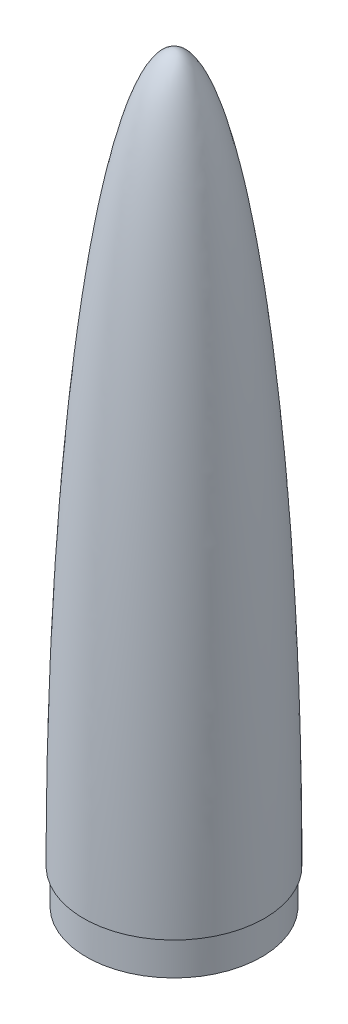
ISO-10303-21;
HEADER;
FILE_DESCRIPTION(('STEP AP214'),'2;1');
FILE_NAME('part.step','',(''),(''),'','','');
FILE_SCHEMA(('AUTOMOTIVE_DESIGN { 1 0 10303 214 1 1 1 1 }'));
ENDSEC;
DATA;
#1=APPLICATION_CONTEXT('core data for automotive mechanical design processes');
#2=APPLICATION_PROTOCOL_DEFINITION('international standard','automotive_design',2000,#1);
#3=PRODUCT_CONTEXT('',#1,'mechanical');
#4=PRODUCT('Part','Part','',(#3));
#5=PRODUCT_RELATED_PRODUCT_CATEGORY('part','',(#4));
#6=PRODUCT_DEFINITION_FORMATION('','',#4);
#7=PRODUCT_DEFINITION_CONTEXT('part definition',#1,'design');
#8=PRODUCT_DEFINITION('design','',#6,#7);
#9=PRODUCT_DEFINITION_SHAPE('','',#8);
#10=(LENGTH_UNIT() NAMED_UNIT(*) SI_UNIT(.MILLI.,.METRE.));
#11=(NAMED_UNIT(*) PLANE_ANGLE_UNIT() SI_UNIT($,.RADIAN.));
#12=(NAMED_UNIT(*) SI_UNIT($,.STERADIAN.) SOLID_ANGLE_UNIT());
#13=UNCERTAINTY_MEASURE_WITH_UNIT(LENGTH_MEASURE(1.E-05),#10,'distance_accuracy_value','');
#14=(GEOMETRIC_REPRESENTATION_CONTEXT(3) GLOBAL_UNCERTAINTY_ASSIGNED_CONTEXT((#13)) GLOBAL_UNIT_ASSIGNED_CONTEXT((#10,
#11,#12)) REPRESENTATION_CONTEXT('',''));
#15=CARTESIAN_POINT('',(0.,0.,0.));
#16=DIRECTION('',(0.,0.,1.));
#17=DIRECTION('',(1.,0.,0.));
#18=AXIS2_PLACEMENT_3D('',#15,#16,#17);
#19=CARTESIAN_POINT('',(0.,0.,0.));
#20=DIRECTION('',(0.,1.,0.));
#21=DIRECTION('',(-1.,0.,0.));
#22=AXIS2_PLACEMENT_3D('',#19,#20,#21);
#23=PLANE('',#22);
#24=CARTESIAN_POINT('',(0.,0.,0.));
#25=DIRECTION('',(0.,-1.,0.));
#26=DIRECTION('',(1.,0.,0.));
#27=AXIS2_PLACEMENT_3D('',#24,#25,#26);
#28=CIRCLE('',#27,37.79);
#29=CARTESIAN_POINT('',(37.79,0.,0.));
#30=VERTEX_POINT('',#29);
#31=EDGE_CURVE('E11',#30,#30,#28,.T.);
#32=ORIENTED_EDGE('',*,*,#31,.F.);
#33=EDGE_LOOP('',(#32));
#34=FACE_BOUND('',#33,.T.);
#35=CARTESIAN_POINT('',(0.,0.,0.));
#36=DIRECTION('',(0.,-1.,0.));
#37=DIRECTION('',(1.,0.,0.));
#38=AXIS2_PLACEMENT_3D('',#35,#36,#37);
#39=CIRCLE('',#38,38.99);
#40=CARTESIAN_POINT('',(38.99,0.,0.));
#41=VERTEX_POINT('',#40);
#42=EDGE_CURVE('E58',#41,#41,#39,.T.);
#43=ORIENTED_EDGE('',*,*,#42,.T.);
#44=EDGE_LOOP('',(#43));
#45=FACE_BOUND('',#44,.T.);
#46=ADVANCED_FACE('F47',(#34,#45),#23,.F.);
#47=CARTESIAN_POINT('',(0.,0.,0.));
#48=DIRECTION('',(0.,0.,1.));
#49=DIRECTION('',(0.,1.,0.));
#50=AXIS2_PLACEMENT_3D('',#47,#48,#49);
#51=ELLIPSE('',#50,305.,38.99);
#52=TRIMMED_CURVE('',#51,(PARAMETER_VALUE(3.14159265358979)),
(PARAMETER_VALUE(6.28318530717959)),.T.,.PARAMETER.);
#53=CARTESIAN_POINT('',(0.,0.,0.));
#54=DIRECTION('',(0.,-1.,0.));
#55=AXIS1_PLACEMENT('',#53,#54);
#56=SURFACE_OF_REVOLUTION('',#52,#55);
#57=CARTESIAN_POINT('',(0.,305.,0.));
#58=VERTEX_POINT('',#57);
#59=VERTEX_LOOP('',#58);
#60=FACE_BOUND('',#59,.T.);
#61=ORIENTED_EDGE('',*,*,#42,.F.);
#62=EDGE_LOOP('',(#61));
#63=FACE_BOUND('',#62,.T.);
#64=ADVANCED_FACE('F64',(#60,#63),#56,.F.);
#65=CARTESIAN_POINT('',(0.,3.00000000000003,0.));
#66=DIRECTION('',(0.,1.,0.));
#67=DIRECTION('',(0.,0.,1.));
#68=AXIS2_PLACEMENT_3D('',#65,#66,#67);
#69=CONICAL_SURFACE('',#68,37.79,0.785398163397446);
#70=CARTESIAN_POINT('',(0.,1.50000000000002,0.));
#71=DIRECTION('',(0.,-1.,0.));
#72=DIRECTION('',(0.,0.,-1.));
#73=AXIS2_PLACEMENT_3D('',#70,#71,#72);
#74=CIRCLE('',#73,36.29);
#75=CARTESIAN_POINT('',(0.,1.50000000000002,-36.29));
#76=VERTEX_POINT('',#75);
#77=EDGE_CURVE('E117',#76,#76,#74,.T.);
#78=ORIENTED_EDGE('',*,*,#77,.T.);
#79=EDGE_LOOP('',(#78));
#80=FACE_BOUND('',#79,.T.);
#81=CARTESIAN_POINT('',(0.,2.9981090152685,0.));
#82=DIRECTION('',(0.,-1.,0.));
#83=DIRECTION('',(1.,0.,0.));
#84=AXIS2_PLACEMENT_3D('',#81,#82,#83);
#85=CIRCLE('',#84,37.7881090152684);
#86=CARTESIAN_POINT('',(37.7881090152684,2.9981090152685,0.));
#87=VERTEX_POINT('',#86);
#88=EDGE_CURVE('E52',#87,#87,#85,.T.);
#89=ORIENTED_EDGE('',*,*,#88,.F.);
#90=EDGE_LOOP('',(#89));
#91=FACE_BOUND('',#90,.T.);
#92=ADVANCED_FACE('F67',(#80,#91),#69,.F.);
#93=CARTESIAN_POINT('',(0.,0.,0.));
#94=DIRECTION('',(0.,-1.,0.));
#95=DIRECTION('',(0.,0.,-1.));
#96=AXIS2_PLACEMENT_3D('',#93,#94,#95);
#97=CYLINDRICAL_SURFACE('',#96,37.79);
#98=CARTESIAN_POINT('',(0.,-15.,0.));
#99=DIRECTION('',(0.,-1.,0.));
#100=DIRECTION('',(0.,0.,-1.));
#101=AXIS2_PLACEMENT_3D('',#98,#99,#100);
#102=CIRCLE('',#101,37.79);
#103=CARTESIAN_POINT('',(0.,-15.,-37.79));
#104=VERTEX_POINT('',#103);
#105=EDGE_CURVE('E76',#104,#104,#102,.T.);
#106=ORIENTED_EDGE('',*,*,#105,.F.);
#107=EDGE_LOOP('',(#106));
#108=FACE_BOUND('',#107,.T.);
#109=ORIENTED_EDGE('',*,*,#31,.T.);
#110=EDGE_LOOP('',(#109));
#111=FACE_BOUND('',#110,.T.);
#112=ADVANCED_FACE('F92',(#108,#111),#97,.T.);
#113=CARTESIAN_POINT('',(37.79,-15.,0.));
#114=DIRECTION('',(0.,-1.,0.));
#115=DIRECTION('',(0.,0.,-1.));
#116=AXIS2_PLACEMENT_3D('',#113,#114,#115);
#117=PLANE('',#116);
#118=ORIENTED_EDGE('',*,*,#105,.T.);
#119=EDGE_LOOP('',(#118));
#120=FACE_BOUND('',#119,.T.);
#121=CARTESIAN_POINT('',(0.,-15.,0.));
#122=DIRECTION('',(0.,-1.,0.));
#123=DIRECTION('',(0.,0.,-1.));
#124=AXIS2_PLACEMENT_3D('',#121,#122,#123);
#125=CIRCLE('',#124,36.29);
#126=CARTESIAN_POINT('',(0.,-15.,-36.29));
#127=VERTEX_POINT('',#126);
#128=EDGE_CURVE('E114',#127,#127,#125,.T.);
#129=ORIENTED_EDGE('',*,*,#128,.F.);
#130=EDGE_LOOP('',(#129));
#131=FACE_BOUND('',#130,.T.);
#132=ADVANCED_FACE('F84',(#120,#131),#117,.T.);
#133=CARTESIAN_POINT('',(0.,0.,0.));
#134=DIRECTION('',(0.,-1.,0.));
#135=DIRECTION('',(0.,0.,-1.));
#136=AXIS2_PLACEMENT_3D('',#133,#134,#135);
#137=CYLINDRICAL_SURFACE('',#136,36.29);
#138=ORIENTED_EDGE('',*,*,#128,.T.);
#139=EDGE_LOOP('',(#138));
#140=FACE_BOUND('',#139,.T.);
#141=ORIENTED_EDGE('',*,*,#77,.F.);
#142=EDGE_LOOP('',(#141));
#143=FACE_BOUND('',#142,.T.);
#144=ADVANCED_FACE('F100',(#140,#143),#137,.F.);
#145=CARTESIAN_POINT('',(37.79,0.,0.));
#146=CARTESIAN_POINT('',(37.79,9.96023644432431,0.));
#147=CARTESIAN_POINT('',(37.6646944416075,29.9355725462488,0.));
#148=CARTESIAN_POINT('',(37.1026550416885,59.5658619842099,0.));
#149=CARTESIAN_POINT('',(36.1719204923581,88.6332451117315,0.));
#150=CARTESIAN_POINT('',(34.4516167057034,126.2464121439,0.));
#151=CARTESIAN_POINT('',(31.4319735214777,170.440975847829,0.));
#152=CARTESIAN_POINT('',(26.5566848436871,216.909350239995,0.));
#153=CARTESIAN_POINT('',(21.6094204080246,248.663260812449,0.));
#154=CARTESIAN_POINT('',(17.240887319488,269.142472583423,0.));
#155=CARTESIAN_POINT('',(13.7952020720237,281.888207179951,0.));
#156=CARTESIAN_POINT('',(10.2234610323318,291.880973095913,0.));
#157=CARTESIAN_POINT('',(7.19161539353613,297.807361864009,0.));
#158=CARTESIAN_POINT('',(4.80162206307366,301.04274795178,0.));
#159=CARTESIAN_POINT('',(3.07144677578734,302.705487016752,0.));
#160=CARTESIAN_POINT('',(1.44843264571311,303.619825672567,0.));
#161=CARTESIAN_POINT('',(0.503435410311526,303.8,0.));
#162=CARTESIAN_POINT('',(0.,303.8,0.));
#163=B_SPLINE_CURVE_WITH_KNOTS('',3,(#145,#146,#147,#148,#149,#150,#151,#152,#153,#154,#155,
#156,#157,#158,#159,#160,#161,#162),.UNSPECIFIED.,.F.,.F.,(4,1,1,1,1,1,1,1,1,1,1,1,1,1,1,4),
(-1.5707963267949,-1.47262155637022,-1.37444678594553,-1.27627201552085,-1.17809724509617,
-0.98174770424681,-0.785398163397448,-0.589048622548086,-0.490873852123405,-0.392699081698724,
-0.294524311274043,-0.196349540849362,-0.147262155637022,-0.098174770424681,-0.0490873852123405,
0.),.UNSPECIFIED.);
#164=CARTESIAN_POINT('',(0.,0.,0.));
#165=DIRECTION('',(0.,-1.,0.));
#166=AXIS1_PLACEMENT('',#164,#165);
#167=SURFACE_OF_REVOLUTION('',#163,#166);
#168=ORIENTED_EDGE('',*,*,#88,.T.);
#169=EDGE_LOOP('',(#168));
#170=FACE_BOUND('',#169,.T.);
#171=CARTESIAN_POINT('',(0.,303.8,0.));
#172=VERTEX_POINT('',#171);
#173=VERTEX_LOOP('',#172);
#174=FACE_BOUND('',#173,.T.);
#175=ADVANCED_FACE('F49',(#170,#174),#167,.T.);
#176=CLOSED_SHELL('',(#46,#64,#92,#112,#132,#144,#175));
#177=MANIFOLD_SOLID_BREP('B2',#176);
#178=ADVANCED_BREP_SHAPE_REPRESENTATION('',(#18,#177),#14);
#179=SHAPE_DEFINITION_REPRESENTATION(#9,#178);
ENDSEC;
END-ISO-10303-21;
